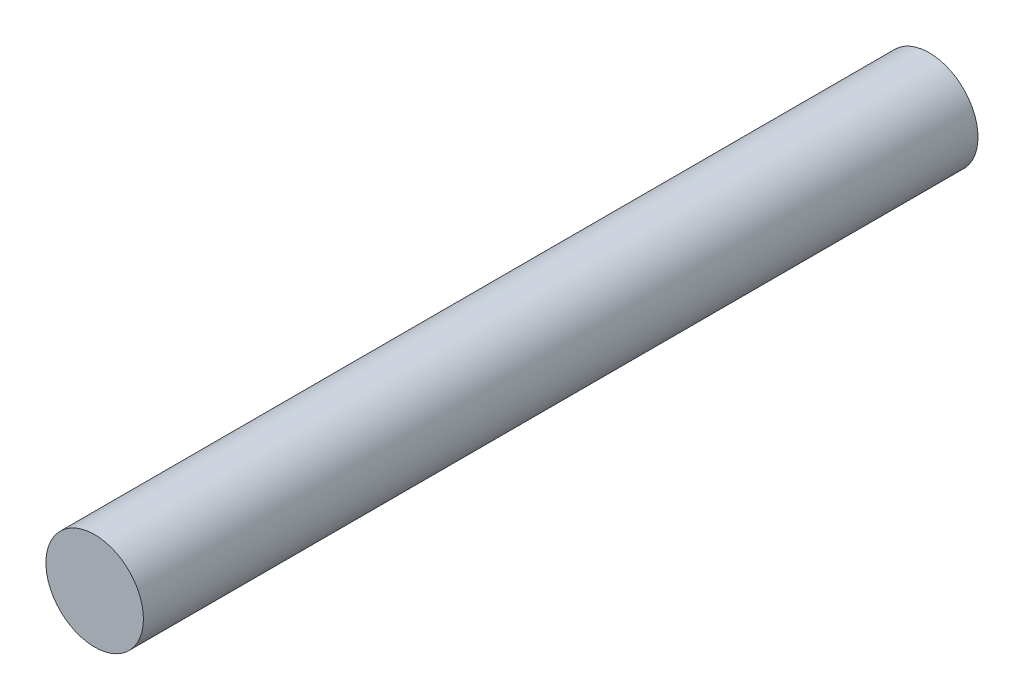
ISO-10303-21;
HEADER;
FILE_DESCRIPTION(('STEP AP214'),'2;1');
FILE_NAME('part.step','',(''),(''),'','','');
FILE_SCHEMA(('AUTOMOTIVE_DESIGN { 1 0 10303 214 1 1 1 1 }'));
ENDSEC;
DATA;
#1=APPLICATION_CONTEXT('core data for automotive mechanical design processes');
#2=APPLICATION_PROTOCOL_DEFINITION('international standard','automotive_design',2000,#1);
#3=PRODUCT_CONTEXT('',#1,'mechanical');
#4=PRODUCT('Part','Part','',(#3));
#5=PRODUCT_RELATED_PRODUCT_CATEGORY('part','',(#4));
#6=PRODUCT_DEFINITION_FORMATION('','',#4);
#7=PRODUCT_DEFINITION_CONTEXT('part definition',#1,'design');
#8=PRODUCT_DEFINITION('design','',#6,#7);
#9=PRODUCT_DEFINITION_SHAPE('','',#8);
#10=(LENGTH_UNIT() NAMED_UNIT(*) SI_UNIT(.MILLI.,.METRE.));
#11=(NAMED_UNIT(*) PLANE_ANGLE_UNIT() SI_UNIT($,.RADIAN.));
#12=(NAMED_UNIT(*) SI_UNIT($,.STERADIAN.) SOLID_ANGLE_UNIT());
#13=UNCERTAINTY_MEASURE_WITH_UNIT(LENGTH_MEASURE(1.E-05),#10,'distance_accuracy_value','');
#14=(GEOMETRIC_REPRESENTATION_CONTEXT(3) GLOBAL_UNCERTAINTY_ASSIGNED_CONTEXT((#13)) GLOBAL_UNIT_ASSIGNED_CONTEXT((#10,
#11,#12)) REPRESENTATION_CONTEXT('',''));
#15=CARTESIAN_POINT('',(0.,0.,0.));
#16=DIRECTION('',(0.,0.,1.));
#17=DIRECTION('',(1.,0.,0.));
#18=AXIS2_PLACEMENT_3D('',#15,#16,#17);
#19=CARTESIAN_POINT('',(0.,0.,21.4));
#20=DIRECTION('',(0.,0.,-1.));
#21=DIRECTION('',(-1.,0.,0.));
#22=AXIS2_PLACEMENT_3D('',#19,#20,#21);
#23=CYLINDRICAL_SURFACE('',#22,1.25);
#24=CARTESIAN_POINT('',(0.,0.,21.4));
#25=DIRECTION('',(0.,0.,1.));
#26=DIRECTION('',(1.,0.,0.));
#27=AXIS2_PLACEMENT_3D('',#24,#25,#26);
#28=CIRCLE('',#27,1.25);
#29=CARTESIAN_POINT('',(1.25,0.,21.4));
#30=VERTEX_POINT('',#29);
#31=EDGE_CURVE('E10',#30,#30,#28,.T.);
#32=ORIENTED_EDGE('',*,*,#31,.F.);
#33=EDGE_LOOP('',(#32));
#34=FACE_BOUND('',#33,.T.);
#35=CARTESIAN_POINT('',(0.,0.,0.));
#36=DIRECTION('',(0.,0.,1.));
#37=DIRECTION('',(1.,0.,0.));
#38=AXIS2_PLACEMENT_3D('',#35,#36,#37);
#39=CIRCLE('',#38,1.25);
#40=CARTESIAN_POINT('',(1.25,0.,0.));
#41=VERTEX_POINT('',#40);
#42=EDGE_CURVE('E40',#41,#41,#39,.T.);
#43=ORIENTED_EDGE('',*,*,#42,.T.);
#44=EDGE_LOOP('',(#43));
#45=FACE_BOUND('',#44,.T.);
#46=ADVANCED_FACE('F37',(#34,#45),#23,.T.);
#47=CARTESIAN_POINT('',(0.,0.,21.4));
#48=DIRECTION('',(0.,0.,1.));
#49=DIRECTION('',(1.,0.,0.));
#50=AXIS2_PLACEMENT_3D('',#47,#48,#49);
#51=PLANE('',#50);
#52=ORIENTED_EDGE('',*,*,#31,.T.);
#53=EDGE_LOOP('',(#52));
#54=FACE_BOUND('',#53,.T.);
#55=ADVANCED_FACE('F52',(#54),#51,.T.);
#56=CARTESIAN_POINT('',(0.,0.,0.));
#57=DIRECTION('',(0.,0.,1.));
#58=DIRECTION('',(1.,0.,0.));
#59=AXIS2_PLACEMENT_3D('',#56,#57,#58);
#60=PLANE('',#59);
#61=ORIENTED_EDGE('',*,*,#42,.F.);
#62=EDGE_LOOP('',(#61));
#63=FACE_BOUND('',#62,.T.);
#64=ADVANCED_FACE('F50',(#63),#60,.F.);
#65=CLOSED_SHELL('',(#46,#55,#64));
#66=MANIFOLD_SOLID_BREP('B2',#65);
#67=ADVANCED_BREP_SHAPE_REPRESENTATION('',(#18,#66),#14);
#68=SHAPE_DEFINITION_REPRESENTATION(#9,#67);
ENDSEC;
END-ISO-10303-21;
